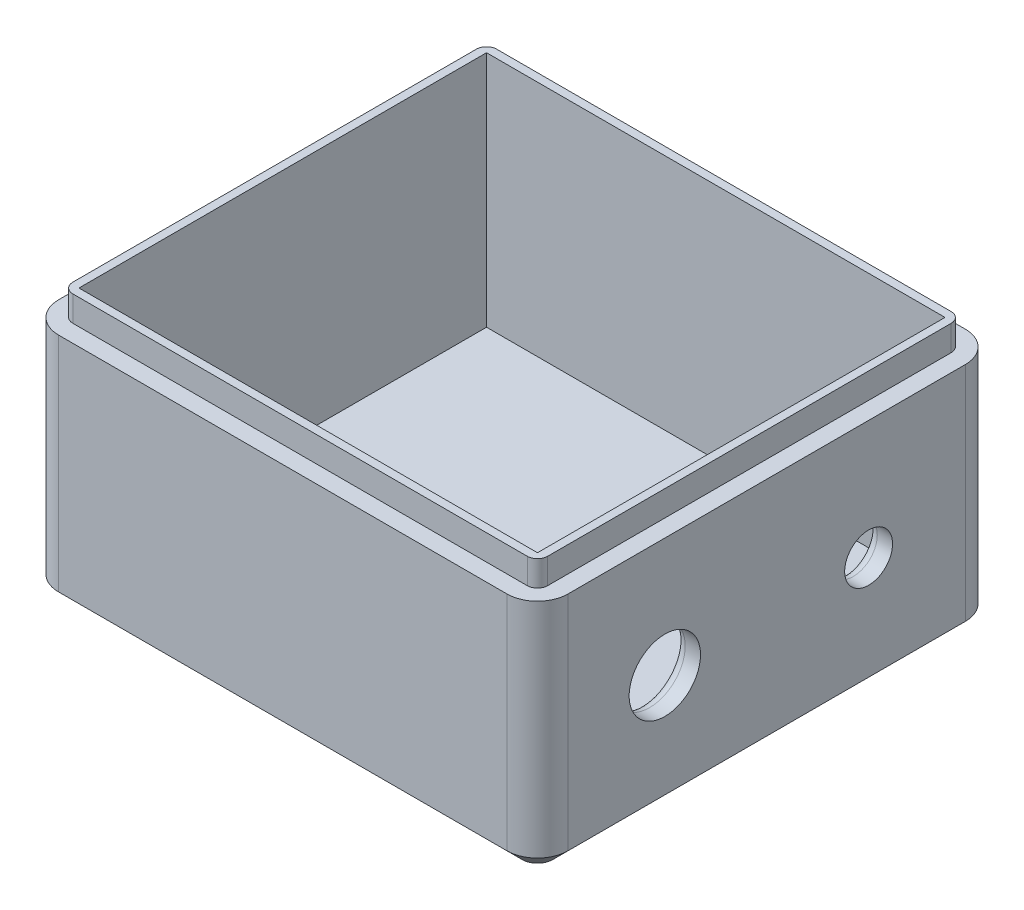
ISO-10303-21;
HEADER;
FILE_DESCRIPTION(('STEP AP214'),'2;1');
FILE_NAME('part.step','',(''),(''),'','','');
FILE_SCHEMA(('AUTOMOTIVE_DESIGN { 1 0 10303 214 1 1 1 1 }'));
ENDSEC;
DATA;
#1=APPLICATION_CONTEXT('core data for automotive mechanical design processes');
#2=APPLICATION_PROTOCOL_DEFINITION('international standard','automotive_design',2000,#1);
#3=PRODUCT_CONTEXT('',#1,'mechanical');
#4=PRODUCT('Part','Part','',(#3));
#5=PRODUCT_RELATED_PRODUCT_CATEGORY('part','',(#4));
#6=PRODUCT_DEFINITION_FORMATION('','',#4);
#7=PRODUCT_DEFINITION_CONTEXT('part definition',#1,'design');
#8=PRODUCT_DEFINITION('design','',#6,#7);
#9=PRODUCT_DEFINITION_SHAPE('','',#8);
#10=(LENGTH_UNIT() NAMED_UNIT(*) SI_UNIT(.MILLI.,.METRE.));
#11=(NAMED_UNIT(*) PLANE_ANGLE_UNIT() SI_UNIT($,.RADIAN.));
#12=(NAMED_UNIT(*) SI_UNIT($,.STERADIAN.) SOLID_ANGLE_UNIT());
#13=UNCERTAINTY_MEASURE_WITH_UNIT(LENGTH_MEASURE(1.E-05),#10,'distance_accuracy_value','');
#14=(GEOMETRIC_REPRESENTATION_CONTEXT(3) GLOBAL_UNCERTAINTY_ASSIGNED_CONTEXT((#13)) GLOBAL_UNIT_ASSIGNED_CONTEXT((#10,
#11,#12)) REPRESENTATION_CONTEXT('',''));
#15=CARTESIAN_POINT('',(0.,0.,0.));
#16=DIRECTION('',(0.,0.,1.));
#17=DIRECTION('',(1.,0.,0.));
#18=AXIS2_PLACEMENT_3D('',#15,#16,#17);
#19=CARTESIAN_POINT('',(0.,23.3333333333333,45.));
#20=DIRECTION('',(0.,-1.,0.));
#21=DIRECTION('',(0.,0.,-1.));
#22=AXIS2_PLACEMENT_3D('',#19,#20,#21);
#23=PLANE('',#22);
#24=DIRECTION('',(1.,0.,0.));
#25=VECTOR('',#24,1.);
#26=CARTESIAN_POINT('',(0.,23.3333333333333,0.));
#27=LINE('',#26,#25);
#28=CARTESIAN_POINT('',(3.,23.3333333333333,0.));
#29=VERTEX_POINT('',#28);
#30=CARTESIAN_POINT('',(47.,23.3333333333333,0.));
#31=VERTEX_POINT('',#30);
#32=EDGE_CURVE('E280',#29,#31,#27,.T.);
#33=ORIENTED_EDGE('',*,*,#32,.F.);
#34=CARTESIAN_POINT('',(3.,23.3333333333333,3.));
#35=DIRECTION('',(0.,-1.,0.));
#36=DIRECTION('',(0.,0.,-1.));
#37=AXIS2_PLACEMENT_3D('',#34,#35,#36);
#38=CIRCLE('',#37,3.);
#39=CARTESIAN_POINT('',(0.,23.3333333333333,3.00000000000002));
#40=VERTEX_POINT('',#39);
#41=EDGE_CURVE('E301',#29,#40,#38,.F.);
#42=ORIENTED_EDGE('',*,*,#41,.T.);
#43=DIRECTION('',(0.,0.,-1.));
#44=VECTOR('',#43,1.);
#45=CARTESIAN_POINT('',(0.,23.3333333333333,45.));
#46=LINE('',#45,#44);
#47=CARTESIAN_POINT('',(0.,23.3333333333333,42.));
#48=VERTEX_POINT('',#47);
#49=EDGE_CURVE('E274',#48,#40,#46,.T.);
#50=ORIENTED_EDGE('',*,*,#49,.F.);
#51=CARTESIAN_POINT('',(3.,23.3333333333333,42.));
#52=DIRECTION('',(0.,-1.,0.));
#53=DIRECTION('',(0.,0.,-1.));
#54=AXIS2_PLACEMENT_3D('',#51,#52,#53);
#55=CIRCLE('',#54,3.);
#56=CARTESIAN_POINT('',(3.,23.3333333333333,45.));
#57=VERTEX_POINT('',#56);
#58=EDGE_CURVE('E295',#48,#57,#55,.F.);
#59=ORIENTED_EDGE('',*,*,#58,.T.);
#60=DIRECTION('',(1.,0.,0.));
#61=VECTOR('',#60,1.);
#62=CARTESIAN_POINT('',(0.,23.3333333333333,45.));
#63=LINE('',#62,#61);
#64=CARTESIAN_POINT('',(47.,23.3333333333333,45.));
#65=VERTEX_POINT('',#64);
#66=EDGE_CURVE('E277',#57,#65,#63,.T.);
#67=ORIENTED_EDGE('',*,*,#66,.T.);
#68=CARTESIAN_POINT('',(47.,23.3333333333333,42.));
#69=DIRECTION('',(0.,-1.,0.));
#70=DIRECTION('',(0.,0.,-1.));
#71=AXIS2_PLACEMENT_3D('',#68,#69,#70);
#72=CIRCLE('',#71,3.);
#73=CARTESIAN_POINT('',(50.,23.3333333333333,42.));
#74=VERTEX_POINT('',#73);
#75=EDGE_CURVE('E297',#65,#74,#72,.F.);
#76=ORIENTED_EDGE('',*,*,#75,.T.);
#77=DIRECTION('',(0.,0.,-1.));
#78=VECTOR('',#77,1.);
#79=CARTESIAN_POINT('',(50.,23.3333333333333,45.));
#80=LINE('',#79,#78);
#81=CARTESIAN_POINT('',(50.,23.3333333333333,3.00000000000002));
#82=VERTEX_POINT('',#81);
#83=EDGE_CURVE('E265',#74,#82,#80,.T.);
#84=ORIENTED_EDGE('',*,*,#83,.T.);
#85=CARTESIAN_POINT('',(47.,23.3333333333333,3.));
#86=DIRECTION('',(0.,-1.,0.));
#87=DIRECTION('',(0.,0.,-1.));
#88=AXIS2_PLACEMENT_3D('',#85,#86,#87);
#89=CIRCLE('',#88,3.);
#90=EDGE_CURVE('E299',#82,#31,#89,.F.);
#91=ORIENTED_EDGE('',*,*,#90,.T.);
#92=EDGE_LOOP('',(#33,#42,#50,#59,#67,#76,#84,#91));
#93=FACE_BOUND('',#92,.T.);
#94=DIRECTION('',(0.,0.,1.));
#95=VECTOR('',#94,1.);
#96=CARTESIAN_POINT('',(1.7,23.3333333333333,1.7));
#97=LINE('',#96,#95);
#98=CARTESIAN_POINT('',(1.7,23.3333333333333,2.7));
#99=VERTEX_POINT('',#98);
#100=CARTESIAN_POINT('',(1.7,23.3333333333333,42.3));
#101=VERTEX_POINT('',#100);
#102=EDGE_CURVE('E231',#99,#101,#97,.T.);
#103=ORIENTED_EDGE('',*,*,#102,.F.);
#104=CARTESIAN_POINT('',(2.7,23.3333333333333,2.7));
#105=DIRECTION('',(0.,-1.,0.));
#106=DIRECTION('',(0.,0.,-1.));
#107=AXIS2_PLACEMENT_3D('',#104,#105,#106);
#108=CIRCLE('',#107,1.);
#109=CARTESIAN_POINT('',(2.7,23.3333333333333,1.7));
#110=VERTEX_POINT('',#109);
#111=EDGE_CURVE('E341',#99,#110,#108,.T.);
#112=ORIENTED_EDGE('',*,*,#111,.T.);
#113=DIRECTION('',(-1.,0.,0.));
#114=VECTOR('',#113,1.);
#115=CARTESIAN_POINT('',(1.7,23.3333333333333,1.7));
#116=LINE('',#115,#114);
#117=CARTESIAN_POINT('',(47.3,23.3333333333333,1.7));
#118=VERTEX_POINT('',#117);
#119=EDGE_CURVE('E236',#118,#110,#116,.T.);
#120=ORIENTED_EDGE('',*,*,#119,.F.);
#121=CARTESIAN_POINT('',(47.3,23.3333333333333,2.7));
#122=DIRECTION('',(0.,-1.,0.));
#123=DIRECTION('',(0.,0.,-1.));
#124=AXIS2_PLACEMENT_3D('',#121,#122,#123);
#125=CIRCLE('',#124,1.);
#126=CARTESIAN_POINT('',(48.3,23.3333333333333,2.7));
#127=VERTEX_POINT('',#126);
#128=EDGE_CURVE('E343',#118,#127,#125,.T.);
#129=ORIENTED_EDGE('',*,*,#128,.T.);
#130=DIRECTION('',(0.,0.,-1.));
#131=VECTOR('',#130,1.);
#132=CARTESIAN_POINT('',(48.3,23.3333333333333,1.7));
#133=LINE('',#132,#131);
#134=CARTESIAN_POINT('',(48.3,23.3333333333333,42.3));
#135=VERTEX_POINT('',#134);
#136=EDGE_CURVE('E251',#135,#127,#133,.T.);
#137=ORIENTED_EDGE('',*,*,#136,.F.);
#138=CARTESIAN_POINT('',(47.3,23.3333333333333,42.3));
#139=DIRECTION('',(0.,-1.,0.));
#140=DIRECTION('',(0.,0.,-1.));
#141=AXIS2_PLACEMENT_3D('',#138,#139,#140);
#142=CIRCLE('',#141,1.);
#143=CARTESIAN_POINT('',(47.3,23.3333333333333,43.3));
#144=VERTEX_POINT('',#143);
#145=EDGE_CURVE('E345',#135,#144,#142,.T.);
#146=ORIENTED_EDGE('',*,*,#145,.T.);
#147=DIRECTION('',(1.,0.,0.));
#148=VECTOR('',#147,1.);
#149=CARTESIAN_POINT('',(1.7,23.3333333333333,43.3));
#150=LINE('',#149,#148);
#151=CARTESIAN_POINT('',(2.7,23.3333333333333,43.3));
#152=VERTEX_POINT('',#151);
#153=EDGE_CURVE('E248',#152,#144,#150,.T.);
#154=ORIENTED_EDGE('',*,*,#153,.F.);
#155=CARTESIAN_POINT('',(2.7,23.3333333333333,42.3));
#156=DIRECTION('',(0.,-1.,0.));
#157=DIRECTION('',(0.,0.,-1.));
#158=AXIS2_PLACEMENT_3D('',#155,#156,#157);
#159=CIRCLE('',#158,1.);
#160=EDGE_CURVE('E339',#152,#101,#159,.T.);
#161=ORIENTED_EDGE('',*,*,#160,.T.);
#162=EDGE_LOOP('',(#103,#112,#120,#129,#137,#146,#154,#161));
#163=FACE_BOUND('',#162,.T.);
#164=ADVANCED_FACE('F38',(#93,#163),#23,.F.);
#165=CARTESIAN_POINT('',(0.,0.,45.));
#166=DIRECTION('',(1.,0.,0.));
#167=DIRECTION('',(0.,0.,-1.));
#168=AXIS2_PLACEMENT_3D('',#165,#166,#167);
#169=PLANE('',#168);
#170=DIRECTION('',(0.,-1.,0.));
#171=VECTOR('',#170,1.);
#172=CARTESIAN_POINT('',(0.,0.,3.));
#173=LINE('',#172,#171);
#174=CARTESIAN_POINT('',(0.,1.5,3.));
#175=VERTEX_POINT('',#174);
#176=EDGE_CURVE('E287',#40,#175,#173,.T.);
#177=ORIENTED_EDGE('',*,*,#176,.T.);
#178=DIRECTION('',(0.,0.,1.));
#179=VECTOR('',#178,1.);
#180=CARTESIAN_POINT('',(0.,1.5,45.));
#181=LINE('',#180,#179);
#182=CARTESIAN_POINT('',(0.,1.5,42.));
#183=VERTEX_POINT('',#182);
#184=EDGE_CURVE('E367',#175,#183,#181,.T.);
#185=ORIENTED_EDGE('',*,*,#184,.T.);
#186=DIRECTION('',(0.,-1.,0.));
#187=VECTOR('',#186,1.);
#188=CARTESIAN_POINT('',(0.,0.,42.));
#189=LINE('',#188,#187);
#190=EDGE_CURVE('E283',#183,#48,#189,.F.);
#191=ORIENTED_EDGE('',*,*,#190,.T.);
#192=ORIENTED_EDGE('',*,*,#49,.T.);
#193=EDGE_LOOP('',(#177,#185,#191,#192));
#194=FACE_BOUND('',#193,.T.);
#195=ADVANCED_FACE('F468',(#194),#169,.F.);
#196=CARTESIAN_POINT('',(0.,0.,45.));
#197=DIRECTION('',(0.,1.,0.));
#198=DIRECTION('',(0.,0.,1.));
#199=AXIS2_PLACEMENT_3D('',#196,#197,#198);
#200=PLANE('',#199);
#201=DIRECTION('',(0.,0.,-1.));
#202=VECTOR('',#201,1.);
#203=CARTESIAN_POINT('',(1.50000000000001,0.,45.));
#204=LINE('',#203,#202);
#205=CARTESIAN_POINT('',(1.50000000000001,0.,42.));
#206=VERTEX_POINT('',#205);
#207=CARTESIAN_POINT('',(1.50000000000001,0.,3.));
#208=VERTEX_POINT('',#207);
#209=EDGE_CURVE('E359',#206,#208,#204,.T.);
#210=ORIENTED_EDGE('',*,*,#209,.T.);
#211=CARTESIAN_POINT('',(3.,0.,3.));
#212=DIRECTION('',(0.,1.,0.));
#213=DIRECTION('',(0.,0.,1.));
#214=AXIS2_PLACEMENT_3D('',#211,#212,#213);
#215=CIRCLE('',#214,1.49999999999999);
#216=CARTESIAN_POINT('',(3.,0.,1.50000000000001));
#217=VERTEX_POINT('',#216);
#218=EDGE_CURVE('E361',#208,#217,#215,.F.);
#219=ORIENTED_EDGE('',*,*,#218,.T.);
#220=DIRECTION('',(1.,0.,0.));
#221=VECTOR('',#220,1.);
#222=CARTESIAN_POINT('',(47.,0.,1.50000000000001));
#223=LINE('',#222,#221);
#224=CARTESIAN_POINT('',(47.,0.,1.50000000000001));
#225=VERTEX_POINT('',#224);
#226=EDGE_CURVE('E357',#217,#225,#223,.T.);
#227=ORIENTED_EDGE('',*,*,#226,.T.);
#228=CARTESIAN_POINT('',(47.,0.,3.));
#229=DIRECTION('',(0.,1.,0.));
#230=DIRECTION('',(0.,0.,1.));
#231=AXIS2_PLACEMENT_3D('',#228,#229,#230);
#232=CIRCLE('',#231,1.49999999999999);
#233=CARTESIAN_POINT('',(48.5,0.,3.));
#234=VERTEX_POINT('',#233);
#235=EDGE_CURVE('E355',#225,#234,#232,.F.);
#236=ORIENTED_EDGE('',*,*,#235,.T.);
#237=DIRECTION('',(0.,0.,1.));
#238=VECTOR('',#237,1.);
#239=CARTESIAN_POINT('',(48.5,0.,45.));
#240=LINE('',#239,#238);
#241=CARTESIAN_POINT('',(48.5,0.,42.));
#242=VERTEX_POINT('',#241);
#243=EDGE_CURVE('E351',#234,#242,#240,.T.);
#244=ORIENTED_EDGE('',*,*,#243,.T.);
#245=CARTESIAN_POINT('',(47.,0.,42.));
#246=DIRECTION('',(0.,1.,0.));
#247=DIRECTION('',(0.,0.,1.));
#248=AXIS2_PLACEMENT_3D('',#245,#246,#247);
#249=CIRCLE('',#248,1.49999999999999);
#250=CARTESIAN_POINT('',(47.,0.,43.5));
#251=VERTEX_POINT('',#250);
#252=EDGE_CURVE('E349',#242,#251,#249,.F.);
#253=ORIENTED_EDGE('',*,*,#252,.T.);
#254=DIRECTION('',(-1.,0.,0.));
#255=VECTOR('',#254,1.);
#256=CARTESIAN_POINT('',(0.,0.,43.5));
#257=LINE('',#256,#255);
#258=CARTESIAN_POINT('',(3.,0.,43.5));
#259=VERTEX_POINT('',#258);
#260=EDGE_CURVE('E347',#251,#259,#257,.T.);
#261=ORIENTED_EDGE('',*,*,#260,.T.);
#262=CARTESIAN_POINT('',(3.,0.,42.));
#263=DIRECTION('',(0.,1.,0.));
#264=DIRECTION('',(0.,0.,1.));
#265=AXIS2_PLACEMENT_3D('',#262,#263,#264);
#266=CIRCLE('',#265,1.49999999999999);
#267=EDGE_CURVE('E353',#259,#206,#266,.F.);
#268=ORIENTED_EDGE('',*,*,#267,.T.);
#269=EDGE_LOOP('',(#210,#219,#227,#236,#244,#253,#261,#268));
#270=FACE_BOUND('',#269,.T.);
#271=ADVANCED_FACE('F429',(#270),#200,.F.);
#272=CARTESIAN_POINT('',(50.,0.,45.));
#273=DIRECTION('',(-1.,0.,0.));
#274=DIRECTION('',(0.,0.,1.));
#275=AXIS2_PLACEMENT_3D('',#272,#273,#274);
#276=PLANE('',#275);
#277=CARTESIAN_POINT('',(50.,11.6666666666667,32.5));
#278=DIRECTION('',(1.,0.,0.));
#279=DIRECTION('',(0.,0.,-1.));
#280=AXIS2_PLACEMENT_3D('',#277,#278,#279);
#281=CIRCLE('',#280,3.5);
#282=CARTESIAN_POINT('',(50.,11.6666666666667,29.));
#283=VERTEX_POINT('',#282);
#284=EDGE_CURVE('E256',#283,#283,#281,.T.);
#285=ORIENTED_EDGE('',*,*,#284,.F.);
#286=EDGE_LOOP('',(#285));
#287=FACE_BOUND('',#286,.T.);
#288=CARTESIAN_POINT('',(50.,11.6666666666667,12.5));
#289=DIRECTION('',(1.,0.,0.));
#290=DIRECTION('',(0.,0.,-1.));
#291=AXIS2_PLACEMENT_3D('',#288,#289,#290);
#292=CIRCLE('',#291,2.35);
#293=CARTESIAN_POINT('',(50.,11.6666666666667,10.15));
#294=VERTEX_POINT('',#293);
#295=EDGE_CURVE('E245',#294,#294,#292,.T.);
#296=ORIENTED_EDGE('',*,*,#295,.F.);
#297=EDGE_LOOP('',(#296));
#298=FACE_BOUND('',#297,.T.);
#299=DIRECTION('',(0.,1.,0.));
#300=VECTOR('',#299,1.);
#301=CARTESIAN_POINT('',(50.,0.,42.));
#302=LINE('',#301,#300);
#303=CARTESIAN_POINT('',(50.,1.5,42.));
#304=VERTEX_POINT('',#303);
#305=EDGE_CURVE('E303',#74,#304,#302,.F.);
#306=ORIENTED_EDGE('',*,*,#305,.T.);
#307=DIRECTION('',(0.,0.,-1.));
#308=VECTOR('',#307,1.);
#309=CARTESIAN_POINT('',(50.,1.5,45.));
#310=LINE('',#309,#308);
#311=CARTESIAN_POINT('',(50.,1.5,3.));
#312=VERTEX_POINT('',#311);
#313=EDGE_CURVE('E375',#304,#312,#310,.T.);
#314=ORIENTED_EDGE('',*,*,#313,.T.);
#315=DIRECTION('',(0.,1.,0.));
#316=VECTOR('',#315,1.);
#317=CARTESIAN_POINT('',(50.,23.3333333333333,3.));
#318=LINE('',#317,#316);
#319=EDGE_CURVE('E305',#312,#82,#318,.T.);
#320=ORIENTED_EDGE('',*,*,#319,.T.);
#321=ORIENTED_EDGE('',*,*,#83,.F.);
#322=EDGE_LOOP('',(#306,#314,#320,#321));
#323=FACE_BOUND('',#322,.T.);
#324=ADVANCED_FACE('F425',(#287,#298,#323),#276,.F.);
#325=CARTESIAN_POINT('',(0.,0.,45.));
#326=DIRECTION('',(0.,0.,-1.));
#327=DIRECTION('',(-1.,0.,0.));
#328=AXIS2_PLACEMENT_3D('',#325,#326,#327);
#329=PLANE('',#328);
#330=DIRECTION('',(0.,-1.,0.));
#331=VECTOR('',#330,1.);
#332=CARTESIAN_POINT('',(3.,0.,45.));
#333=LINE('',#332,#331);
#334=CARTESIAN_POINT('',(3.,1.5,45.));
#335=VERTEX_POINT('',#334);
#336=EDGE_CURVE('E307',#57,#335,#333,.T.);
#337=ORIENTED_EDGE('',*,*,#336,.T.);
#338=DIRECTION('',(1.,0.,0.));
#339=VECTOR('',#338,1.);
#340=CARTESIAN_POINT('',(0.,1.5,45.));
#341=LINE('',#340,#339);
#342=CARTESIAN_POINT('',(47.,1.5,45.));
#343=VERTEX_POINT('',#342);
#344=EDGE_CURVE('E53',#335,#343,#341,.T.);
#345=ORIENTED_EDGE('',*,*,#344,.T.);
#346=DIRECTION('',(0.,1.,0.));
#347=VECTOR('',#346,1.);
#348=CARTESIAN_POINT('',(47.,0.,45.));
#349=LINE('',#348,#347);
#350=EDGE_CURVE('E309',#343,#65,#349,.T.);
#351=ORIENTED_EDGE('',*,*,#350,.T.);
#352=ORIENTED_EDGE('',*,*,#66,.F.);
#353=EDGE_LOOP('',(#337,#345,#351,#352));
#354=FACE_BOUND('',#353,.T.);
#355=ADVANCED_FACE('F428',(#354),#329,.F.);
#356=CARTESIAN_POINT('',(0.,0.,0.));
#357=DIRECTION('',(0.,0.,-1.));
#358=DIRECTION('',(-1.,0.,0.));
#359=AXIS2_PLACEMENT_3D('',#356,#357,#358);
#360=PLANE('',#359);
#361=DIRECTION('',(0.,1.,0.));
#362=VECTOR('',#361,1.);
#363=CARTESIAN_POINT('',(47.,0.,0.));
#364=LINE('',#363,#362);
#365=CARTESIAN_POINT('',(47.,1.5,0.));
#366=VERTEX_POINT('',#365);
#367=EDGE_CURVE('E290',#31,#366,#364,.F.);
#368=ORIENTED_EDGE('',*,*,#367,.T.);
#369=DIRECTION('',(-1.,0.,0.));
#370=VECTOR('',#369,1.);
#371=CARTESIAN_POINT('',(3.,1.5,0.));
#372=LINE('',#371,#370);
#373=CARTESIAN_POINT('',(3.,1.5,0.));
#374=VERTEX_POINT('',#373);
#375=EDGE_CURVE('E369',#366,#374,#372,.T.);
#376=ORIENTED_EDGE('',*,*,#375,.T.);
#377=DIRECTION('',(0.,-1.,0.));
#378=VECTOR('',#377,1.);
#379=CARTESIAN_POINT('',(3.,23.3333333333333,0.));
#380=LINE('',#379,#378);
#381=EDGE_CURVE('E293',#374,#29,#380,.F.);
#382=ORIENTED_EDGE('',*,*,#381,.T.);
#383=ORIENTED_EDGE('',*,*,#32,.T.);
#384=EDGE_LOOP('',(#368,#376,#382,#383));
#385=FACE_BOUND('',#384,.T.);
#386=ADVANCED_FACE('F456',(#385),#360,.T.);
#387=CARTESIAN_POINT('',(2.5,0.,45.));
#388=DIRECTION('',(1.,0.,0.));
#389=DIRECTION('',(0.,0.,-1.));
#390=AXIS2_PLACEMENT_3D('',#387,#388,#389);
#391=PLANE('',#390);
#392=DIRECTION('',(0.,-1.,0.));
#393=VECTOR('',#392,1.);
#394=CARTESIAN_POINT('',(2.5,0.,42.5));
#395=LINE('',#394,#393);
#396=CARTESIAN_POINT('',(2.5,25.8333333333333,42.5));
#397=VERTEX_POINT('',#396);
#398=CARTESIAN_POINT('',(2.5,2.5,42.5));
#399=VERTEX_POINT('',#398);
#400=EDGE_CURVE('E201',#397,#399,#395,.T.);
#401=ORIENTED_EDGE('',*,*,#400,.T.);
#402=DIRECTION('',(0.,0.,-1.));
#403=VECTOR('',#402,1.);
#404=CARTESIAN_POINT('',(2.5,2.5,45.));
#405=LINE('',#404,#403);
#406=CARTESIAN_POINT('',(2.5,2.5,2.5));
#407=VERTEX_POINT('',#406);
#408=EDGE_CURVE('E263',#399,#407,#405,.T.);
#409=ORIENTED_EDGE('',*,*,#408,.T.);
#410=DIRECTION('',(0.,-1.,0.));
#411=VECTOR('',#410,1.);
#412=CARTESIAN_POINT('',(2.5,0.,2.5));
#413=LINE('',#412,#411);
#414=CARTESIAN_POINT('',(2.5,25.8333333333333,2.5));
#415=VERTEX_POINT('',#414);
#416=EDGE_CURVE('E217',#415,#407,#413,.T.);
#417=ORIENTED_EDGE('',*,*,#416,.F.);
#418=DIRECTION('',(0.,0.,1.));
#419=VECTOR('',#418,1.);
#420=CARTESIAN_POINT('',(2.5,25.8333333333333,2.5));
#421=LINE('',#420,#419);
#422=EDGE_CURVE('E215',#415,#397,#421,.T.);
#423=ORIENTED_EDGE('',*,*,#422,.T.);
#424=EDGE_LOOP('',(#401,#409,#417,#423));
#425=FACE_BOUND('',#424,.T.);
#426=ADVANCED_FACE('F216',(#425),#391,.T.);
#427=CARTESIAN_POINT('',(0.,2.5,45.));
#428=DIRECTION('',(0.,1.,0.));
#429=DIRECTION('',(0.,0.,1.));
#430=AXIS2_PLACEMENT_3D('',#427,#428,#429);
#431=PLANE('',#430);
#432=DIRECTION('',(1.,0.,0.));
#433=VECTOR('',#432,1.);
#434=CARTESIAN_POINT('',(0.,2.5,2.5));
#435=LINE('',#434,#433);
#436=CARTESIAN_POINT('',(47.5,2.5,2.5));
#437=VERTEX_POINT('',#436);
#438=EDGE_CURVE('E262',#407,#437,#435,.T.);
#439=ORIENTED_EDGE('',*,*,#438,.F.);
#440=ORIENTED_EDGE('',*,*,#408,.F.);
#441=DIRECTION('',(1.,0.,0.));
#442=VECTOR('',#441,1.);
#443=CARTESIAN_POINT('',(0.,2.5,42.5));
#444=LINE('',#443,#442);
#445=CARTESIAN_POINT('',(47.5,2.5,42.5));
#446=VERTEX_POINT('',#445);
#447=EDGE_CURVE('E208',#399,#446,#444,.T.);
#448=ORIENTED_EDGE('',*,*,#447,.T.);
#449=DIRECTION('',(0.,0.,-1.));
#450=VECTOR('',#449,1.);
#451=CARTESIAN_POINT('',(47.5,2.5,45.));
#452=LINE('',#451,#450);
#453=EDGE_CURVE('E266',#446,#437,#452,.T.);
#454=ORIENTED_EDGE('',*,*,#453,.T.);
#455=EDGE_LOOP('',(#439,#440,#448,#454));
#456=FACE_BOUND('',#455,.T.);
#457=ADVANCED_FACE('F588',(#456),#431,.T.);
#458=CARTESIAN_POINT('',(47.5,0.,45.));
#459=DIRECTION('',(-1.,0.,0.));
#460=DIRECTION('',(0.,0.,1.));
#461=AXIS2_PLACEMENT_3D('',#458,#459,#460);
#462=PLANE('',#461);
#463=CARTESIAN_POINT('',(47.5,11.6666666666667,12.5));
#464=DIRECTION('',(-1.,0.,0.));
#465=DIRECTION('',(0.,0.,1.));
#466=AXIS2_PLACEMENT_3D('',#463,#464,#465);
#467=CIRCLE('',#466,3.35);
#468=CARTESIAN_POINT('',(47.5,11.6666666666667,15.85));
#469=VERTEX_POINT('',#468);
#470=EDGE_CURVE('E46',#469,#469,#467,.F.);
#471=ORIENTED_EDGE('',*,*,#470,.T.);
#472=EDGE_LOOP('',(#471));
#473=FACE_BOUND('',#472,.T.);
#474=CARTESIAN_POINT('',(47.5,11.6666666666667,32.5));
#475=DIRECTION('',(-1.,0.,0.));
#476=DIRECTION('',(0.,0.,1.));
#477=AXIS2_PLACEMENT_3D('',#474,#475,#476);
#478=CIRCLE('',#477,4.5);
#479=CARTESIAN_POINT('',(47.5,11.6666666666667,37.));
#480=VERTEX_POINT('',#479);
#481=EDGE_CURVE('E403',#480,#480,#478,.F.);
#482=ORIENTED_EDGE('',*,*,#481,.T.);
#483=EDGE_LOOP('',(#482));
#484=FACE_BOUND('',#483,.T.);
#485=DIRECTION('',(0.,1.,0.));
#486=VECTOR('',#485,1.);
#487=CARTESIAN_POINT('',(47.5,0.,2.5));
#488=LINE('',#487,#486);
#489=CARTESIAN_POINT('',(47.5,25.8333333333333,2.5));
#490=VERTEX_POINT('',#489);
#491=EDGE_CURVE('E212',#437,#490,#488,.T.);
#492=ORIENTED_EDGE('',*,*,#491,.F.);
#493=ORIENTED_EDGE('',*,*,#453,.F.);
#494=DIRECTION('',(0.,1.,0.));
#495=VECTOR('',#494,1.);
#496=CARTESIAN_POINT('',(47.5,0.,42.5));
#497=LINE('',#496,#495);
#498=CARTESIAN_POINT('',(47.5,25.8333333333333,42.5));
#499=VERTEX_POINT('',#498);
#500=EDGE_CURVE('E270',#446,#499,#497,.T.);
#501=ORIENTED_EDGE('',*,*,#500,.T.);
#502=DIRECTION('',(0.,0.,-1.));
#503=VECTOR('',#502,1.);
#504=CARTESIAN_POINT('',(47.5,25.8333333333333,2.5));
#505=LINE('',#504,#503);
#506=EDGE_CURVE('E225',#499,#490,#505,.T.);
#507=ORIENTED_EDGE('',*,*,#506,.T.);
#508=EDGE_LOOP('',(#492,#493,#501,#507));
#509=FACE_BOUND('',#508,.T.);
#510=ADVANCED_FACE('F408',(#473,#484,#509),#462,.T.);
#511=CARTESIAN_POINT('',(0.,0.,42.5));
#512=DIRECTION('',(0.,0.,-1.));
#513=DIRECTION('',(-1.,0.,0.));
#514=AXIS2_PLACEMENT_3D('',#511,#512,#513);
#515=PLANE('',#514);
#516=ORIENTED_EDGE('',*,*,#500,.F.);
#517=ORIENTED_EDGE('',*,*,#447,.F.);
#518=ORIENTED_EDGE('',*,*,#400,.F.);
#519=DIRECTION('',(1.,0.,0.));
#520=VECTOR('',#519,1.);
#521=CARTESIAN_POINT('',(2.5,25.8333333333333,42.5));
#522=LINE('',#521,#520);
#523=EDGE_CURVE('E206',#397,#499,#522,.T.);
#524=ORIENTED_EDGE('',*,*,#523,.T.);
#525=EDGE_LOOP('',(#516,#517,#518,#524));
#526=FACE_BOUND('',#525,.T.);
#527=ADVANCED_FACE('F204',(#526),#515,.T.);
#528=CARTESIAN_POINT('',(0.,0.,2.5));
#529=DIRECTION('',(0.,0.,-1.));
#530=DIRECTION('',(-1.,0.,0.));
#531=AXIS2_PLACEMENT_3D('',#528,#529,#530);
#532=PLANE('',#531);
#533=ORIENTED_EDGE('',*,*,#491,.T.);
#534=DIRECTION('',(-1.,0.,0.));
#535=VECTOR('',#534,1.);
#536=CARTESIAN_POINT('',(2.5,25.8333333333333,2.5));
#537=LINE('',#536,#535);
#538=EDGE_CURVE('E227',#490,#415,#537,.T.);
#539=ORIENTED_EDGE('',*,*,#538,.T.);
#540=ORIENTED_EDGE('',*,*,#416,.T.);
#541=ORIENTED_EDGE('',*,*,#438,.T.);
#542=EDGE_LOOP('',(#533,#539,#540,#541));
#543=FACE_BOUND('',#542,.T.);
#544=ADVANCED_FACE('F421',(#543),#532,.F.);
#545=CARTESIAN_POINT('',(46.,11.6666666666667,12.5));
#546=DIRECTION('',(1.,0.,0.));
#547=DIRECTION('',(0.,0.,-1.));
#548=AXIS2_PLACEMENT_3D('',#545,#546,#547);
#549=CYLINDRICAL_SURFACE('',#548,2.35);
#550=CARTESIAN_POINT('',(48.5,11.6666666666667,12.5));
#551=DIRECTION('',(-1.,0.,0.));
#552=DIRECTION('',(0.,0.,1.));
#553=AXIS2_PLACEMENT_3D('',#550,#551,#552);
#554=CIRCLE('',#553,2.35);
#555=CARTESIAN_POINT('',(48.5,11.6666666666667,14.85));
#556=VERTEX_POINT('',#555);
#557=EDGE_CURVE('E379',#556,#556,#554,.T.);
#558=ORIENTED_EDGE('',*,*,#557,.T.);
#559=EDGE_LOOP('',(#558));
#560=FACE_BOUND('',#559,.T.);
#561=ORIENTED_EDGE('',*,*,#295,.T.);
#562=EDGE_LOOP('',(#561));
#563=FACE_BOUND('',#562,.T.);
#564=ADVANCED_FACE('F417',(#560,#563),#549,.F.);
#565=CARTESIAN_POINT('',(46.,11.6666666666667,32.5));
#566=DIRECTION('',(1.,0.,0.));
#567=DIRECTION('',(0.,0.,-1.));
#568=AXIS2_PLACEMENT_3D('',#565,#566,#567);
#569=CYLINDRICAL_SURFACE('',#568,3.5);
#570=CARTESIAN_POINT('',(48.5,11.6666666666667,32.5));
#571=DIRECTION('',(-1.,0.,0.));
#572=DIRECTION('',(0.,0.,1.));
#573=AXIS2_PLACEMENT_3D('',#570,#571,#572);
#574=CIRCLE('',#573,3.5);
#575=CARTESIAN_POINT('',(48.5,11.6666666666667,36.));
#576=VERTEX_POINT('',#575);
#577=EDGE_CURVE('E11',#576,#576,#574,.T.);
#578=ORIENTED_EDGE('',*,*,#577,.T.);
#579=EDGE_LOOP('',(#578));
#580=FACE_BOUND('',#579,.T.);
#581=ORIENTED_EDGE('',*,*,#284,.T.);
#582=EDGE_LOOP('',(#581));
#583=FACE_BOUND('',#582,.T.);
#584=ADVANCED_FACE('F420',(#580,#583),#569,.F.);
#585=CARTESIAN_POINT('',(0.,25.8333333333333,0.));
#586=DIRECTION('',(0.,1.,0.));
#587=DIRECTION('',(0.,0.,1.));
#588=AXIS2_PLACEMENT_3D('',#585,#586,#587);
#589=PLANE('',#588);
#590=DIRECTION('',(0.,0.,1.));
#591=VECTOR('',#590,1.);
#592=CARTESIAN_POINT('',(1.7,25.8333333333333,1.7));
#593=LINE('',#592,#591);
#594=CARTESIAN_POINT('',(1.7,25.8333333333333,2.7));
#595=VERTEX_POINT('',#594);
#596=CARTESIAN_POINT('',(1.7,25.8333333333333,42.3));
#597=VERTEX_POINT('',#596);
#598=EDGE_CURVE('E232',#595,#597,#593,.T.);
#599=ORIENTED_EDGE('',*,*,#598,.T.);
#600=CARTESIAN_POINT('',(2.7,25.8333333333333,42.3));
#601=DIRECTION('',(0.,1.,0.));
#602=DIRECTION('',(0.,0.,1.));
#603=AXIS2_PLACEMENT_3D('',#600,#601,#602);
#604=CIRCLE('',#603,1.);
#605=CARTESIAN_POINT('',(2.7,25.8333333333333,43.3));
#606=VERTEX_POINT('',#605);
#607=EDGE_CURVE('E327',#597,#606,#604,.T.);
#608=ORIENTED_EDGE('',*,*,#607,.T.);
#609=DIRECTION('',(1.,0.,0.));
#610=VECTOR('',#609,1.);
#611=CARTESIAN_POINT('',(1.7,25.8333333333333,43.3));
#612=LINE('',#611,#610);
#613=CARTESIAN_POINT('',(47.3,25.8333333333333,43.3));
#614=VERTEX_POINT('',#613);
#615=EDGE_CURVE('E235',#606,#614,#612,.T.);
#616=ORIENTED_EDGE('',*,*,#615,.T.);
#617=CARTESIAN_POINT('',(47.3,25.8333333333333,42.3));
#618=DIRECTION('',(0.,1.,0.));
#619=DIRECTION('',(0.,0.,1.));
#620=AXIS2_PLACEMENT_3D('',#617,#618,#619);
#621=CIRCLE('',#620,1.);
#622=CARTESIAN_POINT('',(48.3,25.8333333333333,42.3));
#623=VERTEX_POINT('',#622);
#624=EDGE_CURVE('E321',#614,#623,#621,.T.);
#625=ORIENTED_EDGE('',*,*,#624,.T.);
#626=DIRECTION('',(0.,0.,-1.));
#627=VECTOR('',#626,1.);
#628=CARTESIAN_POINT('',(48.3,25.8333333333333,1.7));
#629=LINE('',#628,#627);
#630=CARTESIAN_POINT('',(48.3,25.8333333333333,2.7));
#631=VERTEX_POINT('',#630);
#632=EDGE_CURVE('E239',#623,#631,#629,.T.);
#633=ORIENTED_EDGE('',*,*,#632,.T.);
#634=CARTESIAN_POINT('',(47.3,25.8333333333333,2.7));
#635=DIRECTION('',(0.,1.,0.));
#636=DIRECTION('',(0.,0.,1.));
#637=AXIS2_PLACEMENT_3D('',#634,#635,#636);
#638=CIRCLE('',#637,1.);
#639=CARTESIAN_POINT('',(47.3,25.8333333333333,1.7));
#640=VERTEX_POINT('',#639);
#641=EDGE_CURVE('E323',#631,#640,#638,.T.);
#642=ORIENTED_EDGE('',*,*,#641,.T.);
#643=DIRECTION('',(-1.,0.,0.));
#644=VECTOR('',#643,1.);
#645=CARTESIAN_POINT('',(1.7,25.8333333333333,1.7));
#646=LINE('',#645,#644);
#647=CARTESIAN_POINT('',(2.7,25.8333333333333,1.7));
#648=VERTEX_POINT('',#647);
#649=EDGE_CURVE('E242',#640,#648,#646,.T.);
#650=ORIENTED_EDGE('',*,*,#649,.T.);
#651=CARTESIAN_POINT('',(2.7,25.8333333333333,2.7));
#652=DIRECTION('',(0.,1.,0.));
#653=DIRECTION('',(0.,0.,1.));
#654=AXIS2_PLACEMENT_3D('',#651,#652,#653);
#655=CIRCLE('',#654,1.);
#656=EDGE_CURVE('E325',#648,#595,#655,.T.);
#657=ORIENTED_EDGE('',*,*,#656,.T.);
#658=EDGE_LOOP('',(#599,#608,#616,#625,#633,#642,#650,#657));
#659=FACE_BOUND('',#658,.T.);
#660=ORIENTED_EDGE('',*,*,#523,.F.);
#661=ORIENTED_EDGE('',*,*,#422,.F.);
#662=ORIENTED_EDGE('',*,*,#538,.F.);
#663=ORIENTED_EDGE('',*,*,#506,.F.);
#664=EDGE_LOOP('',(#660,#661,#662,#663));
#665=FACE_BOUND('',#664,.T.);
#666=ADVANCED_FACE('F223',(#659,#665),#589,.T.);
#667=CARTESIAN_POINT('',(1.7,25.8333333333333,1.7));
#668=DIRECTION('',(1.,0.,0.));
#669=DIRECTION('',(0.,0.,-1.));
#670=AXIS2_PLACEMENT_3D('',#667,#668,#669);
#671=PLANE('',#670);
#672=ORIENTED_EDGE('',*,*,#102,.T.);
#673=DIRECTION('',(0.,-1.,0.));
#674=VECTOR('',#673,1.);
#675=CARTESIAN_POINT('',(1.7,25.8333333333333,42.3));
#676=LINE('',#675,#674);
#677=EDGE_CURVE('E319',#101,#597,#676,.F.);
#678=ORIENTED_EDGE('',*,*,#677,.T.);
#679=ORIENTED_EDGE('',*,*,#598,.F.);
#680=DIRECTION('',(0.,-1.,0.));
#681=VECTOR('',#680,1.);
#682=CARTESIAN_POINT('',(1.7,25.8333333333333,2.7));
#683=LINE('',#682,#681);
#684=EDGE_CURVE('E316',#595,#99,#683,.T.);
#685=ORIENTED_EDGE('',*,*,#684,.T.);
#686=EDGE_LOOP('',(#672,#678,#679,#685));
#687=FACE_BOUND('',#686,.T.);
#688=ADVANCED_FACE('F746',(#687),#671,.F.);
#689=CARTESIAN_POINT('',(1.7,25.8333333333333,43.3));
#690=DIRECTION('',(0.,0.,-1.));
#691=DIRECTION('',(-1.,0.,0.));
#692=AXIS2_PLACEMENT_3D('',#689,#690,#691);
#693=PLANE('',#692);
#694=ORIENTED_EDGE('',*,*,#615,.F.);
#695=DIRECTION('',(0.,-1.,0.));
#696=VECTOR('',#695,1.);
#697=CARTESIAN_POINT('',(2.7,25.8333333333333,43.3));
#698=LINE('',#697,#696);
#699=EDGE_CURVE('E313',#606,#152,#698,.T.);
#700=ORIENTED_EDGE('',*,*,#699,.T.);
#701=ORIENTED_EDGE('',*,*,#153,.T.);
#702=DIRECTION('',(0.,-1.,0.));
#703=VECTOR('',#702,1.);
#704=CARTESIAN_POINT('',(47.3,25.8333333333333,43.3));
#705=LINE('',#704,#703);
#706=EDGE_CURVE('E311',#144,#614,#705,.F.);
#707=ORIENTED_EDGE('',*,*,#706,.T.);
#708=EDGE_LOOP('',(#694,#700,#701,#707));
#709=FACE_BOUND('',#708,.T.);
#710=ADVANCED_FACE('F737',(#709),#693,.F.);
#711=CARTESIAN_POINT('',(48.3,25.8333333333333,1.7));
#712=DIRECTION('',(-1.,0.,0.));
#713=DIRECTION('',(0.,0.,1.));
#714=AXIS2_PLACEMENT_3D('',#711,#712,#713);
#715=PLANE('',#714);
#716=ORIENTED_EDGE('',*,*,#136,.T.);
#717=DIRECTION('',(0.,-1.,0.));
#718=VECTOR('',#717,1.);
#719=CARTESIAN_POINT('',(48.3,25.8333333333333,2.7));
#720=LINE('',#719,#718);
#721=EDGE_CURVE('E337',#127,#631,#720,.F.);
#722=ORIENTED_EDGE('',*,*,#721,.T.);
#723=ORIENTED_EDGE('',*,*,#632,.F.);
#724=DIRECTION('',(0.,-1.,0.));
#725=VECTOR('',#724,1.);
#726=CARTESIAN_POINT('',(48.3,25.8333333333333,42.3));
#727=LINE('',#726,#725);
#728=EDGE_CURVE('E334',#623,#135,#727,.T.);
#729=ORIENTED_EDGE('',*,*,#728,.T.);
#730=EDGE_LOOP('',(#716,#722,#723,#729));
#731=FACE_BOUND('',#730,.T.);
#732=ADVANCED_FACE('F729',(#731),#715,.F.);
#733=CARTESIAN_POINT('',(1.7,25.8333333333333,1.7));
#734=DIRECTION('',(0.,0.,1.));
#735=DIRECTION('',(1.,0.,0.));
#736=AXIS2_PLACEMENT_3D('',#733,#734,#735);
#737=PLANE('',#736);
#738=ORIENTED_EDGE('',*,*,#119,.T.);
#739=DIRECTION('',(0.,-1.,0.));
#740=VECTOR('',#739,1.);
#741=CARTESIAN_POINT('',(2.7,25.8333333333333,1.7));
#742=LINE('',#741,#740);
#743=EDGE_CURVE('E332',#110,#648,#742,.F.);
#744=ORIENTED_EDGE('',*,*,#743,.T.);
#745=ORIENTED_EDGE('',*,*,#649,.F.);
#746=DIRECTION('',(0.,-1.,0.));
#747=VECTOR('',#746,1.);
#748=CARTESIAN_POINT('',(47.3,25.8333333333333,1.7));
#749=LINE('',#748,#747);
#750=EDGE_CURVE('E329',#640,#118,#749,.T.);
#751=ORIENTED_EDGE('',*,*,#750,.T.);
#752=EDGE_LOOP('',(#738,#744,#745,#751));
#753=FACE_BOUND('',#752,.T.);
#754=ADVANCED_FACE('F520',(#753),#737,.F.);
#755=CARTESIAN_POINT('',(3.,0.,3.));
#756=DIRECTION('',(0.,1.,0.));
#757=DIRECTION('',(0.,0.,1.));
#758=AXIS2_PLACEMENT_3D('',#755,#756,#757);
#759=CYLINDRICAL_SURFACE('',#758,3.);
#760=ORIENTED_EDGE('',*,*,#381,.F.);
#761=CARTESIAN_POINT('',(3.,1.5,3.));
#762=DIRECTION('',(0.,1.,0.));
#763=DIRECTION('',(0.,0.,1.));
#764=AXIS2_PLACEMENT_3D('',#761,#762,#763);
#765=CIRCLE('',#764,3.);
#766=EDGE_CURVE('E364',#374,#175,#765,.T.);
#767=ORIENTED_EDGE('',*,*,#766,.T.);
#768=ORIENTED_EDGE('',*,*,#176,.F.);
#769=ORIENTED_EDGE('',*,*,#41,.F.);
#770=EDGE_LOOP('',(#760,#767,#768,#769));
#771=FACE_BOUND('',#770,.T.);
#772=ADVANCED_FACE('F465',(#771),#759,.T.);
#773=CARTESIAN_POINT('',(47.,0.,3.));
#774=DIRECTION('',(0.,-1.,0.));
#775=DIRECTION('',(0.,0.,-1.));
#776=AXIS2_PLACEMENT_3D('',#773,#774,#775);
#777=CYLINDRICAL_SURFACE('',#776,3.);
#778=ORIENTED_EDGE('',*,*,#319,.F.);
#779=CARTESIAN_POINT('',(47.,1.5,3.));
#780=DIRECTION('',(0.,1.,0.));
#781=DIRECTION('',(0.,0.,1.));
#782=AXIS2_PLACEMENT_3D('',#779,#780,#781);
#783=CIRCLE('',#782,3.);
#784=EDGE_CURVE('E371',#312,#366,#783,.T.);
#785=ORIENTED_EDGE('',*,*,#784,.T.);
#786=ORIENTED_EDGE('',*,*,#367,.F.);
#787=ORIENTED_EDGE('',*,*,#90,.F.);
#788=EDGE_LOOP('',(#778,#785,#786,#787));
#789=FACE_BOUND('',#788,.T.);
#790=ADVANCED_FACE('F453',(#789),#777,.T.);
#791=CARTESIAN_POINT('',(47.,0.,42.));
#792=DIRECTION('',(0.,1.,0.));
#793=DIRECTION('',(0.,0.,1.));
#794=AXIS2_PLACEMENT_3D('',#791,#792,#793);
#795=CYLINDRICAL_SURFACE('',#794,3.);
#796=ORIENTED_EDGE('',*,*,#350,.F.);
#797=CARTESIAN_POINT('',(47.,1.5,42.));
#798=DIRECTION('',(0.,1.,0.));
#799=DIRECTION('',(0.,0.,1.));
#800=AXIS2_PLACEMENT_3D('',#797,#798,#799);
#801=CIRCLE('',#800,3.);
#802=EDGE_CURVE('E60',#343,#304,#801,.T.);
#803=ORIENTED_EDGE('',*,*,#802,.T.);
#804=ORIENTED_EDGE('',*,*,#305,.F.);
#805=ORIENTED_EDGE('',*,*,#75,.F.);
#806=EDGE_LOOP('',(#796,#803,#804,#805));
#807=FACE_BOUND('',#806,.T.);
#808=ADVANCED_FACE('F523',(#807),#795,.T.);
#809=CARTESIAN_POINT('',(3.,0.,42.));
#810=DIRECTION('',(0.,-1.,0.));
#811=DIRECTION('',(0.,0.,-1.));
#812=AXIS2_PLACEMENT_3D('',#809,#810,#811);
#813=CYLINDRICAL_SURFACE('',#812,3.);
#814=ORIENTED_EDGE('',*,*,#190,.F.);
#815=CARTESIAN_POINT('',(3.,1.5,42.));
#816=DIRECTION('',(0.,1.,0.));
#817=DIRECTION('',(0.,0.,1.));
#818=AXIS2_PLACEMENT_3D('',#815,#816,#817);
#819=CIRCLE('',#818,3.);
#820=EDGE_CURVE('E373',#183,#335,#819,.T.);
#821=ORIENTED_EDGE('',*,*,#820,.T.);
#822=ORIENTED_EDGE('',*,*,#336,.F.);
#823=ORIENTED_EDGE('',*,*,#58,.F.);
#824=EDGE_LOOP('',(#814,#821,#822,#823));
#825=FACE_BOUND('',#824,.T.);
#826=ADVANCED_FACE('F475',(#825),#813,.T.);
#827=CARTESIAN_POINT('',(2.7,25.8333333333333,42.3));
#828=DIRECTION('',(0.,-1.,0.));
#829=DIRECTION('',(0.,0.,-1.));
#830=AXIS2_PLACEMENT_3D('',#827,#828,#829);
#831=CYLINDRICAL_SURFACE('',#830,1.);
#832=ORIENTED_EDGE('',*,*,#607,.F.);
#833=ORIENTED_EDGE('',*,*,#677,.F.);
#834=ORIENTED_EDGE('',*,*,#160,.F.);
#835=ORIENTED_EDGE('',*,*,#699,.F.);
#836=EDGE_LOOP('',(#832,#833,#834,#835));
#837=FACE_BOUND('',#836,.T.);
#838=ADVANCED_FACE('F528',(#837),#831,.T.);
#839=CARTESIAN_POINT('',(2.7,25.8333333333333,2.7));
#840=DIRECTION('',(0.,-1.,0.));
#841=DIRECTION('',(0.,0.,-1.));
#842=AXIS2_PLACEMENT_3D('',#839,#840,#841);
#843=CYLINDRICAL_SURFACE('',#842,1.);
#844=ORIENTED_EDGE('',*,*,#656,.F.);
#845=ORIENTED_EDGE('',*,*,#743,.F.);
#846=ORIENTED_EDGE('',*,*,#111,.F.);
#847=ORIENTED_EDGE('',*,*,#684,.F.);
#848=EDGE_LOOP('',(#844,#845,#846,#847));
#849=FACE_BOUND('',#848,.T.);
#850=ADVANCED_FACE('F531',(#849),#843,.T.);
#851=CARTESIAN_POINT('',(47.3,25.8333333333333,2.7));
#852=DIRECTION('',(0.,-1.,0.));
#853=DIRECTION('',(0.,0.,-1.));
#854=AXIS2_PLACEMENT_3D('',#851,#852,#853);
#855=CYLINDRICAL_SURFACE('',#854,1.);
#856=ORIENTED_EDGE('',*,*,#641,.F.);
#857=ORIENTED_EDGE('',*,*,#721,.F.);
#858=ORIENTED_EDGE('',*,*,#128,.F.);
#859=ORIENTED_EDGE('',*,*,#750,.F.);
#860=EDGE_LOOP('',(#856,#857,#858,#859));
#861=FACE_BOUND('',#860,.T.);
#862=ADVANCED_FACE('F535',(#861),#855,.T.);
#863=CARTESIAN_POINT('',(47.3,25.8333333333333,42.3));
#864=DIRECTION('',(0.,-1.,0.));
#865=DIRECTION('',(0.,0.,-1.));
#866=AXIS2_PLACEMENT_3D('',#863,#864,#865);
#867=CYLINDRICAL_SURFACE('',#866,1.);
#868=ORIENTED_EDGE('',*,*,#624,.F.);
#869=ORIENTED_EDGE('',*,*,#706,.F.);
#870=ORIENTED_EDGE('',*,*,#145,.F.);
#871=ORIENTED_EDGE('',*,*,#728,.F.);
#872=EDGE_LOOP('',(#868,#869,#870,#871));
#873=FACE_BOUND('',#872,.T.);
#874=ADVANCED_FACE('F539',(#873),#867,.T.);
#875=CARTESIAN_POINT('',(47.,0.,42.));
#876=DIRECTION('',(0.,1.,0.));
#877=DIRECTION('',(0.,0.,1.));
#878=AXIS2_PLACEMENT_3D('',#875,#876,#877);
#879=CONICAL_SURFACE('',#878,1.49999999999999,0.78539816339745);
#880=DIRECTION('',(-0.707106781186549,-0.707106781186546,0.));
#881=VECTOR('',#880,1.);
#882=CARTESIAN_POINT('',(50.,1.5,42.));
#883=LINE('',#882,#881);
#884=EDGE_CURVE('E396',#304,#242,#883,.T.);
#885=ORIENTED_EDGE('',*,*,#884,.F.);
#886=ORIENTED_EDGE('',*,*,#802,.F.);
#887=DIRECTION('',(0.,0.707106781186546,0.707106781186549));
#888=VECTOR('',#887,1.);
#889=CARTESIAN_POINT('',(47.,0.,43.5));
#890=LINE('',#889,#888);
#891=EDGE_CURVE('E221',#251,#343,#890,.T.);
#892=ORIENTED_EDGE('',*,*,#891,.F.);
#893=ORIENTED_EDGE('',*,*,#252,.F.);
#894=EDGE_LOOP('',(#885,#886,#892,#893));
#895=FACE_BOUND('',#894,.T.);
#896=ADVANCED_FACE('F439',(#895),#879,.T.);
#897=CARTESIAN_POINT('',(0.,1.5,45.));
#898=DIRECTION('',(0.,0.707106781186549,-0.707106781186546));
#899=DIRECTION('',(1.,0.,0.));
#900=AXIS2_PLACEMENT_3D('',#897,#898,#899);
#901=PLANE('',#900);
#902=ORIENTED_EDGE('',*,*,#891,.T.);
#903=ORIENTED_EDGE('',*,*,#344,.F.);
#904=DIRECTION('',(0.,0.707106781186546,0.707106781186549));
#905=VECTOR('',#904,1.);
#906=CARTESIAN_POINT('',(3.,0.,43.5));
#907=LINE('',#906,#905);
#908=EDGE_CURVE('E393',#259,#335,#907,.T.);
#909=ORIENTED_EDGE('',*,*,#908,.F.);
#910=ORIENTED_EDGE('',*,*,#260,.F.);
#911=EDGE_LOOP('',(#902,#903,#909,#910));
#912=FACE_BOUND('',#911,.T.);
#913=ADVANCED_FACE('F479',(#912),#901,.F.);
#914=CARTESIAN_POINT('',(50.,1.5,45.));
#915=DIRECTION('',(-0.707106781186546,0.707106781186549,0.));
#916=DIRECTION('',(0.,0.,-1.));
#917=AXIS2_PLACEMENT_3D('',#914,#915,#916);
#918=PLANE('',#917);
#919=ORIENTED_EDGE('',*,*,#884,.T.);
#920=ORIENTED_EDGE('',*,*,#243,.F.);
#921=DIRECTION('',(-0.707106781186549,-0.707106781186546,0.));
#922=VECTOR('',#921,1.);
#923=CARTESIAN_POINT('',(50.,1.5,3.));
#924=LINE('',#923,#922);
#925=EDGE_CURVE('E390',#312,#234,#924,.T.);
#926=ORIENTED_EDGE('',*,*,#925,.F.);
#927=ORIENTED_EDGE('',*,*,#313,.F.);
#928=EDGE_LOOP('',(#919,#920,#926,#927));
#929=FACE_BOUND('',#928,.T.);
#930=ADVANCED_FACE('F444',(#929),#918,.F.);
#931=CARTESIAN_POINT('',(3.,0.,42.));
#932=DIRECTION('',(0.,1.,0.));
#933=DIRECTION('',(0.,0.,1.));
#934=AXIS2_PLACEMENT_3D('',#931,#932,#933);
#935=CONICAL_SURFACE('',#934,1.49999999999999,0.785398163397451);
#936=ORIENTED_EDGE('',*,*,#908,.T.);
#937=ORIENTED_EDGE('',*,*,#820,.F.);
#938=DIRECTION('',(-0.707106781186549,0.707106781186546,0.));
#939=VECTOR('',#938,1.);
#940=CARTESIAN_POINT('',(1.50000000000001,0.,42.));
#941=LINE('',#940,#939);
#942=EDGE_CURVE('E387',#206,#183,#941,.T.);
#943=ORIENTED_EDGE('',*,*,#942,.F.);
#944=ORIENTED_EDGE('',*,*,#267,.F.);
#945=EDGE_LOOP('',(#936,#937,#943,#944));
#946=FACE_BOUND('',#945,.T.);
#947=ADVANCED_FACE('F483',(#946),#935,.T.);
#948=CARTESIAN_POINT('',(47.,0.,3.));
#949=DIRECTION('',(0.,1.,0.));
#950=DIRECTION('',(0.,0.,1.));
#951=AXIS2_PLACEMENT_3D('',#948,#949,#950);
#952=CONICAL_SURFACE('',#951,1.49999999999999,0.78539816339745);
#953=ORIENTED_EDGE('',*,*,#925,.T.);
#954=ORIENTED_EDGE('',*,*,#235,.F.);
#955=DIRECTION('',(0.,-0.707106781186546,0.707106781186549));
#956=VECTOR('',#955,1.);
#957=CARTESIAN_POINT('',(47.,1.5,0.));
#958=LINE('',#957,#956);
#959=EDGE_CURVE('E384',#366,#225,#958,.T.);
#960=ORIENTED_EDGE('',*,*,#959,.F.);
#961=ORIENTED_EDGE('',*,*,#784,.F.);
#962=EDGE_LOOP('',(#953,#954,#960,#961));
#963=FACE_BOUND('',#962,.T.);
#964=ADVANCED_FACE('F449',(#963),#952,.T.);
#965=CARTESIAN_POINT('',(1.50000000000001,0.,45.));
#966=DIRECTION('',(0.707106781186546,0.707106781186549,0.));
#967=DIRECTION('',(0.,0.,-1.));
#968=AXIS2_PLACEMENT_3D('',#965,#966,#967);
#969=PLANE('',#968);
#970=ORIENTED_EDGE('',*,*,#942,.T.);
#971=ORIENTED_EDGE('',*,*,#184,.F.);
#972=DIRECTION('',(-0.707106781186549,0.707106781186546,0.));
#973=VECTOR('',#972,1.);
#974=CARTESIAN_POINT('',(1.50000000000001,0.,3.));
#975=LINE('',#974,#973);
#976=EDGE_CURVE('E382',#208,#175,#975,.T.);
#977=ORIENTED_EDGE('',*,*,#976,.F.);
#978=ORIENTED_EDGE('',*,*,#209,.F.);
#979=EDGE_LOOP('',(#970,#971,#977,#978));
#980=FACE_BOUND('',#979,.T.);
#981=ADVANCED_FACE('F495',(#980),#969,.F.);
#982=CARTESIAN_POINT('',(0.,0.,1.50000000000001));
#983=DIRECTION('',(0.,-0.707106781186549,-0.707106781186546));
#984=DIRECTION('',(-1.,0.,0.));
#985=AXIS2_PLACEMENT_3D('',#982,#983,#984);
#986=PLANE('',#985);
#987=ORIENTED_EDGE('',*,*,#959,.T.);
#988=ORIENTED_EDGE('',*,*,#226,.F.);
#989=DIRECTION('',(0.,-0.707106781186546,0.707106781186549));
#990=VECTOR('',#989,1.);
#991=CARTESIAN_POINT('',(3.,1.5,0.));
#992=LINE('',#991,#990);
#993=EDGE_CURVE('E380',#374,#217,#992,.T.);
#994=ORIENTED_EDGE('',*,*,#993,.F.);
#995=ORIENTED_EDGE('',*,*,#375,.F.);
#996=EDGE_LOOP('',(#987,#988,#994,#995));
#997=FACE_BOUND('',#996,.T.);
#998=ADVANCED_FACE('F490',(#997),#986,.T.);
#999=CARTESIAN_POINT('',(3.,0.,3.));
#1000=DIRECTION('',(0.,1.,0.));
#1001=DIRECTION('',(0.,0.,1.));
#1002=AXIS2_PLACEMENT_3D('',#999,#1000,#1001);
#1003=CONICAL_SURFACE('',#1002,1.49999999999999,0.785398163397451);
#1004=ORIENTED_EDGE('',*,*,#976,.T.);
#1005=ORIENTED_EDGE('',*,*,#766,.F.);
#1006=ORIENTED_EDGE('',*,*,#993,.T.);
#1007=ORIENTED_EDGE('',*,*,#218,.F.);
#1008=EDGE_LOOP('',(#1004,#1005,#1006,#1007));
#1009=FACE_BOUND('',#1008,.T.);
#1010=ADVANCED_FACE('F414',(#1009),#1003,.T.);
#1011=CARTESIAN_POINT('',(48.5,11.6666666666667,12.5));
#1012=DIRECTION('',(-1.,0.,0.));
#1013=DIRECTION('',(0.,0.,1.));
#1014=AXIS2_PLACEMENT_3D('',#1011,#1012,#1013);
#1015=TOROIDAL_SURFACE('',#1014,3.35,1.);
#1016=ORIENTED_EDGE('',*,*,#470,.F.);
#1017=EDGE_LOOP('',(#1016));
#1018=FACE_BOUND('',#1017,.T.);
#1019=ORIENTED_EDGE('',*,*,#557,.F.);
#1020=EDGE_LOOP('',(#1019));
#1021=FACE_BOUND('',#1020,.T.);
#1022=ADVANCED_FACE('F411',(#1018,#1021),#1015,.T.);
#1023=CARTESIAN_POINT('',(48.5,11.6666666666667,32.5));
#1024=DIRECTION('',(-1.,0.,0.));
#1025=DIRECTION('',(0.,0.,1.));
#1026=AXIS2_PLACEMENT_3D('',#1023,#1024,#1025);
#1027=TOROIDAL_SURFACE('',#1026,4.5,1.);
#1028=ORIENTED_EDGE('',*,*,#481,.F.);
#1029=EDGE_LOOP('',(#1028));
#1030=FACE_BOUND('',#1029,.T.);
#1031=ORIENTED_EDGE('',*,*,#577,.F.);
#1032=EDGE_LOOP('',(#1031));
#1033=FACE_BOUND('',#1032,.T.);
#1034=ADVANCED_FACE('F40',(#1030,#1033),#1027,.T.);
#1035=CLOSED_SHELL('',(#164,#195,#271,#324,#355,#386,#426,#457,#510,#527,#544,#564,#584,#666,
#688,#710,#732,#754,#772,#790,#808,#826,#838,#850,#862,#874,#896,#913,#930,#947,#964,#981,#998,
#1010,#1022,#1034));
#1036=MANIFOLD_SOLID_BREP('B2',#1035);
#1037=ADVANCED_BREP_SHAPE_REPRESENTATION('',(#18,#1036),#14);
#1038=SHAPE_DEFINITION_REPRESENTATION(#9,#1037);
ENDSEC;
END-ISO-10303-21;
